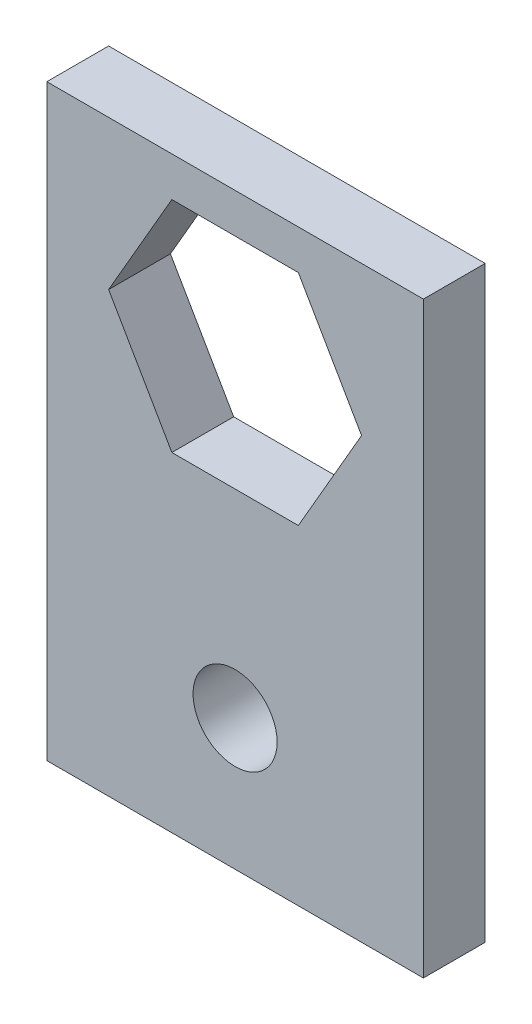
ISO-10303-21;
HEADER;
FILE_DESCRIPTION(('STEP AP214'),'2;1');
FILE_NAME('part.step','',(''),(''),'','','');
FILE_SCHEMA(('AUTOMOTIVE_DESIGN { 1 0 10303 214 1 1 1 1 }'));
ENDSEC;
DATA;
#1=APPLICATION_CONTEXT('core data for automotive mechanical design processes');
#2=APPLICATION_PROTOCOL_DEFINITION('international standard','automotive_design',2000,#1);
#3=PRODUCT_CONTEXT('',#1,'mechanical');
#4=PRODUCT('Part','Part','',(#3));
#5=PRODUCT_RELATED_PRODUCT_CATEGORY('part','',(#4));
#6=PRODUCT_DEFINITION_FORMATION('','',#4);
#7=PRODUCT_DEFINITION_CONTEXT('part definition',#1,'design');
#8=PRODUCT_DEFINITION('design','',#6,#7);
#9=PRODUCT_DEFINITION_SHAPE('','',#8);
#10=(LENGTH_UNIT() NAMED_UNIT(*) SI_UNIT(.MILLI.,.METRE.));
#11=(NAMED_UNIT(*) PLANE_ANGLE_UNIT() SI_UNIT($,.RADIAN.));
#12=(NAMED_UNIT(*) SI_UNIT($,.STERADIAN.) SOLID_ANGLE_UNIT());
#13=UNCERTAINTY_MEASURE_WITH_UNIT(LENGTH_MEASURE(1.E-05),#10,'distance_accuracy_value','');
#14=(GEOMETRIC_REPRESENTATION_CONTEXT(3) GLOBAL_UNCERTAINTY_ASSIGNED_CONTEXT((#13)) GLOBAL_UNIT_ASSIGNED_CONTEXT((#10,
#11,#12)) REPRESENTATION_CONTEXT('',''));
#15=CARTESIAN_POINT('',(0.,0.,0.));
#16=DIRECTION('',(0.,0.,1.));
#17=DIRECTION('',(1.,0.,0.));
#18=AXIS2_PLACEMENT_3D('',#15,#16,#17);
#19=CARTESIAN_POINT('',(-6.02952236372643,-182.568019635189,3.175));
#20=DIRECTION('',(0.,0.,1.));
#21=DIRECTION('',(1.,0.,0.));
#22=AXIS2_PLACEMENT_3D('',#19,#20,#21);
#23=PLANE('',#22);
#24=CARTESIAN_POINT('',(-6.02952236372656,-190.938169146798,3.175));
#25=DIRECTION('',(0.,0.,1.));
#26=DIRECTION('',(1.,0.,0.));
#27=AXIS2_PLACEMENT_3D('',#24,#25,#26);
#28=CIRCLE('',#27,2.159);
#29=CARTESIAN_POINT('',(-3.87052236372656,-190.938169146798,3.175));
#30=VERTEX_POINT('',#29);
#31=EDGE_CURVE('E19',#30,#30,#28,.F.);
#32=ORIENTED_EDGE('',*,*,#31,.T.);
#33=EDGE_LOOP('',(#32));
#34=FACE_BOUND('',#33,.T.);
#35=DIRECTION('',(0.5,-0.866025403784438,0.));
#36=VECTOR('',#35,1.);
#37=CARTESIAN_POINT('',(-9.27775271321431,-180.751070123579,3.175));
#38=LINE('',#37,#36);
#39=CARTESIAN_POINT('',(-9.27775271321431,-180.751070123579,3.175));
#40=VERTEX_POINT('',#39);
#41=CARTESIAN_POINT('',(-12.5259830627021,-175.124970123579,3.175));
#42=VERTEX_POINT('',#41);
#43=EDGE_CURVE('E139',#40,#42,#38,.F.);
#44=ORIENTED_EDGE('',*,*,#43,.T.);
#45=DIRECTION('',(-0.500000000000002,-0.866025403784438,0.));
#46=VECTOR('',#45,1.);
#47=CARTESIAN_POINT('',(-12.5259830627021,-175.124970123579,3.175));
#48=LINE('',#47,#46);
#49=CARTESIAN_POINT('',(-9.27775271321431,-169.498870123579,3.175));
#50=VERTEX_POINT('',#49);
#51=EDGE_CURVE('E144',#42,#50,#48,.F.);
#52=ORIENTED_EDGE('',*,*,#51,.T.);
#53=DIRECTION('',(1.,0.,0.));
#54=VECTOR('',#53,1.);
#55=CARTESIAN_POINT('',(-9.27775271321431,-169.498870123579,3.175));
#56=LINE('',#55,#54);
#57=CARTESIAN_POINT('',(-2.78129201423881,-169.498870123579,3.175));
#58=VERTEX_POINT('',#57);
#59=EDGE_CURVE('E150',#50,#58,#56,.T.);
#60=ORIENTED_EDGE('',*,*,#59,.T.);
#61=DIRECTION('',(-0.500000000000007,0.866025403784435,0.));
#62=VECTOR('',#61,1.);
#63=CARTESIAN_POINT('',(-2.78129201423881,-169.498870123579,3.175));
#64=LINE('',#63,#62);
#65=CARTESIAN_POINT('',(0.466938335248971,-175.124970123579,3.175));
#66=VERTEX_POINT('',#65);
#67=EDGE_CURVE('E124',#58,#66,#64,.F.);
#68=ORIENTED_EDGE('',*,*,#67,.T.);
#69=DIRECTION('',(0.5,0.866025403784439,0.));
#70=VECTOR('',#69,1.);
#71=CARTESIAN_POINT('',(0.46693833524897,-175.124970123579,3.175));
#72=LINE('',#71,#70);
#73=CARTESIAN_POINT('',(-2.78129201423879,-180.751070123579,3.175));
#74=VERTEX_POINT('',#73);
#75=EDGE_CURVE('E129',#66,#74,#72,.F.);
#76=ORIENTED_EDGE('',*,*,#75,.T.);
#77=DIRECTION('',(1.,0.,0.));
#78=VECTOR('',#77,1.);
#79=CARTESIAN_POINT('',(-2.78129201423881,-180.751070123579,3.175));
#80=LINE('',#79,#78);
#81=EDGE_CURVE('E134',#74,#40,#80,.F.);
#82=ORIENTED_EDGE('',*,*,#81,.T.);
#83=EDGE_LOOP('',(#44,#52,#60,#68,#76,#82));
#84=FACE_BOUND('',#83,.T.);
#85=DIRECTION('',(0.,1.,0.));
#86=VECTOR('',#85,1.);
#87=CARTESIAN_POINT('',(-15.7009830627021,-175.12497012358,3.175));
#88=LINE('',#87,#86);
#89=CARTESIAN_POINT('',(-15.700983062702,-197.669169146798,3.175));
#90=VERTEX_POINT('',#89);
#91=CARTESIAN_POINT('',(-15.7009830627022,-167.46687012358,3.175));
#92=VERTEX_POINT('',#91);
#93=EDGE_CURVE('E95',#90,#92,#88,.T.);
#94=ORIENTED_EDGE('',*,*,#93,.F.);
#95=DIRECTION('',(1.,0.,0.));
#96=VECTOR('',#95,1.);
#97=CARTESIAN_POINT('',(-2.85452236372618,-197.669169146798,3.175));
#98=LINE('',#97,#96);
#99=CARTESIAN_POINT('',(3.64193833524926,-197.669169146798,3.175));
#100=VERTEX_POINT('',#99);
#101=EDGE_CURVE('E90',#100,#90,#98,.F.);
#102=ORIENTED_EDGE('',*,*,#101,.F.);
#103=DIRECTION('',(0.,1.,0.));
#104=VECTOR('',#103,1.);
#105=CARTESIAN_POINT('',(3.64193833524897,-175.124970123579,3.175));
#106=LINE('',#105,#104);
#107=CARTESIAN_POINT('',(3.64193833524913,-167.46687012358,3.175));
#108=VERTEX_POINT('',#107);
#109=EDGE_CURVE('E107',#108,#100,#106,.F.);
#110=ORIENTED_EDGE('',*,*,#109,.F.);
#111=DIRECTION('',(1.,0.,0.));
#112=VECTOR('',#111,1.);
#113=CARTESIAN_POINT('',(-15.7009830627022,-167.46687012358,3.175));
#114=LINE('',#113,#112);
#115=EDGE_CURVE('E104',#92,#108,#114,.T.);
#116=ORIENTED_EDGE('',*,*,#115,.F.);
#117=EDGE_LOOP('',(#94,#102,#110,#116));
#118=FACE_BOUND('',#117,.T.);
#119=ADVANCED_FACE('F16',(#34,#84,#118),#23,.T.);
#120=CARTESIAN_POINT('',(-15.7009830627022,-167.46687012358,0.));
#121=DIRECTION('',(0.,1.,0.));
#122=DIRECTION('',(0.,0.,1.));
#123=AXIS2_PLACEMENT_3D('',#120,#121,#122);
#124=PLANE('',#123);
#125=DIRECTION('',(1.,0.,0.));
#126=VECTOR('',#125,1.);
#127=CARTESIAN_POINT('',(-6.02952236372643,-167.46687012358,0.));
#128=LINE('',#127,#126);
#129=CARTESIAN_POINT('',(3.641938335249,-167.46687012358,0.));
#130=VERTEX_POINT('',#129);
#131=CARTESIAN_POINT('',(-15.7009830627022,-167.46687012358,0.));
#132=VERTEX_POINT('',#131);
#133=EDGE_CURVE('E114',#130,#132,#128,.F.);
#134=ORIENTED_EDGE('',*,*,#133,.T.);
#135=DIRECTION('',(0.,0.,1.));
#136=VECTOR('',#135,1.);
#137=CARTESIAN_POINT('',(-15.7009830627021,-167.46687012358,0.));
#138=LINE('',#137,#136);
#139=EDGE_CURVE('E100',#92,#132,#138,.F.);
#140=ORIENTED_EDGE('',*,*,#139,.F.);
#141=ORIENTED_EDGE('',*,*,#115,.T.);
#142=DIRECTION('',(0.,0.,-1.));
#143=VECTOR('',#142,1.);
#144=CARTESIAN_POINT('',(3.64193833524897,-167.46687012358,0.));
#145=LINE('',#144,#143);
#146=EDGE_CURVE('E122',#130,#108,#145,.F.);
#147=ORIENTED_EDGE('',*,*,#146,.F.);
#148=EDGE_LOOP('',(#134,#140,#141,#147));
#149=FACE_BOUND('',#148,.T.);
#150=ADVANCED_FACE('F113',(#149),#124,.T.);
#151=CARTESIAN_POINT('',(-15.7009830627021,-175.12497012358,0.));
#152=DIRECTION('',(-1.,0.,0.));
#153=DIRECTION('',(0.,0.,1.));
#154=AXIS2_PLACEMENT_3D('',#151,#152,#153);
#155=PLANE('',#154);
#156=DIRECTION('',(0.,1.,0.));
#157=VECTOR('',#156,1.);
#158=CARTESIAN_POINT('',(-15.7009830627022,-182.568019635189,0.));
#159=LINE('',#158,#157);
#160=CARTESIAN_POINT('',(-15.700983062702,-197.669169146798,0.));
#161=VERTEX_POINT('',#160);
#162=EDGE_CURVE('E154',#132,#161,#159,.F.);
#163=ORIENTED_EDGE('',*,*,#162,.T.);
#164=DIRECTION('',(0.,0.,-1.));
#165=VECTOR('',#164,1.);
#166=CARTESIAN_POINT('',(-15.7009830627017,-197.669169146798,0.));
#167=LINE('',#166,#165);
#168=EDGE_CURVE('E102',#90,#161,#167,.T.);
#169=ORIENTED_EDGE('',*,*,#168,.F.);
#170=ORIENTED_EDGE('',*,*,#93,.T.);
#171=ORIENTED_EDGE('',*,*,#139,.T.);
#172=EDGE_LOOP('',(#163,#169,#170,#171));
#173=FACE_BOUND('',#172,.T.);
#174=ADVANCED_FACE('F98',(#173),#155,.T.);
#175=CARTESIAN_POINT('',(-2.85452236372618,-197.669169146798,0.));
#176=DIRECTION('',(0.,-1.,0.));
#177=DIRECTION('',(0.,0.,-1.));
#178=AXIS2_PLACEMENT_3D('',#175,#176,#177);
#179=PLANE('',#178);
#180=DIRECTION('',(1.,0.,0.));
#181=VECTOR('',#180,1.);
#182=CARTESIAN_POINT('',(-6.02952236372643,-197.669169146798,0.));
#183=LINE('',#182,#181);
#184=CARTESIAN_POINT('',(3.64193833524926,-197.669169146798,0.));
#185=VERTEX_POINT('',#184);
#186=EDGE_CURVE('E156',#161,#185,#183,.T.);
#187=ORIENTED_EDGE('',*,*,#186,.T.);
#188=DIRECTION('',(0.,0.,-1.));
#189=VECTOR('',#188,1.);
#190=CARTESIAN_POINT('',(3.64193833524897,-197.669169146798,0.));
#191=LINE('',#190,#189);
#192=EDGE_CURVE('E120',#100,#185,#191,.T.);
#193=ORIENTED_EDGE('',*,*,#192,.F.);
#194=ORIENTED_EDGE('',*,*,#101,.T.);
#195=ORIENTED_EDGE('',*,*,#168,.T.);
#196=EDGE_LOOP('',(#187,#193,#194,#195));
#197=FACE_BOUND('',#196,.T.);
#198=ADVANCED_FACE('F234',(#197),#179,.T.);
#199=CARTESIAN_POINT('',(3.64193833524897,-175.124970123579,0.));
#200=DIRECTION('',(1.,0.,0.));
#201=DIRECTION('',(0.,0.,-1.));
#202=AXIS2_PLACEMENT_3D('',#199,#200,#201);
#203=PLANE('',#202);
#204=DIRECTION('',(0.,1.,0.));
#205=VECTOR('',#204,1.);
#206=CARTESIAN_POINT('',(3.64193833524935,-182.568019635189,0.));
#207=LINE('',#206,#205);
#208=EDGE_CURVE('E159',#185,#130,#207,.T.);
#209=ORIENTED_EDGE('',*,*,#208,.T.);
#210=ORIENTED_EDGE('',*,*,#146,.T.);
#211=ORIENTED_EDGE('',*,*,#109,.T.);
#212=ORIENTED_EDGE('',*,*,#192,.T.);
#213=EDGE_LOOP('',(#209,#210,#211,#212));
#214=FACE_BOUND('',#213,.T.);
#215=ADVANCED_FACE('F231',(#214),#203,.T.);
#216=CARTESIAN_POINT('',(-2.78129201423881,-169.498870123579,0.));
#217=DIRECTION('',(0.866025403784435,0.500000000000007,0.));
#218=DIRECTION('',(-0.500000000000007,0.866025403784435,0.));
#219=AXIS2_PLACEMENT_3D('',#216,#217,#218);
#220=PLANE('',#219);
#221=DIRECTION('',(0.,0.,1.));
#222=VECTOR('',#221,1.);
#223=CARTESIAN_POINT('',(-2.78129201423881,-169.498870123579,0.));
#224=LINE('',#223,#222);
#225=CARTESIAN_POINT('',(-2.78129201423881,-169.498870123579,0.));
#226=VERTEX_POINT('',#225);
#227=EDGE_CURVE('E146',#58,#226,#224,.F.);
#228=ORIENTED_EDGE('',*,*,#227,.T.);
#229=DIRECTION('',(0.500000000000007,-0.866025403784435,0.));
#230=VECTOR('',#229,1.);
#231=CARTESIAN_POINT('',(-2.78129201423881,-169.498870123579,0.));
#232=LINE('',#231,#230);
#233=CARTESIAN_POINT('',(0.466938335248971,-175.124970123579,0.));
#234=VERTEX_POINT('',#233);
#235=EDGE_CURVE('E162',#226,#234,#232,.T.);
#236=ORIENTED_EDGE('',*,*,#235,.T.);
#237=DIRECTION('',(0.,0.,1.));
#238=VECTOR('',#237,1.);
#239=CARTESIAN_POINT('',(0.46693833524897,-175.124970123579,0.));
#240=LINE('',#239,#238);
#241=EDGE_CURVE('E126',#234,#66,#240,.T.);
#242=ORIENTED_EDGE('',*,*,#241,.T.);
#243=ORIENTED_EDGE('',*,*,#67,.F.);
#244=EDGE_LOOP('',(#228,#236,#242,#243));
#245=FACE_BOUND('',#244,.T.);
#246=ADVANCED_FACE('F199',(#245),#220,.F.);
#247=CARTESIAN_POINT('',(0.46693833524897,-175.124970123579,0.));
#248=DIRECTION('',(0.866025403784439,-0.5,0.));
#249=DIRECTION('',(0.5,0.866025403784439,0.));
#250=AXIS2_PLACEMENT_3D('',#247,#248,#249);
#251=PLANE('',#250);
#252=ORIENTED_EDGE('',*,*,#241,.F.);
#253=DIRECTION('',(-0.500000000000003,-0.866025403784437,0.));
#254=VECTOR('',#253,1.);
#255=CARTESIAN_POINT('',(0.46693833524897,-175.124970123579,0.));
#256=LINE('',#255,#254);
#257=CARTESIAN_POINT('',(-2.78129201423879,-180.751070123579,0.));
#258=VERTEX_POINT('',#257);
#259=EDGE_CURVE('E165',#234,#258,#256,.T.);
#260=ORIENTED_EDGE('',*,*,#259,.T.);
#261=DIRECTION('',(0.,0.,-1.));
#262=VECTOR('',#261,1.);
#263=CARTESIAN_POINT('',(-2.78129201423881,-180.751070123579,0.));
#264=LINE('',#263,#262);
#265=EDGE_CURVE('E131',#258,#74,#264,.F.);
#266=ORIENTED_EDGE('',*,*,#265,.T.);
#267=ORIENTED_EDGE('',*,*,#75,.F.);
#268=EDGE_LOOP('',(#252,#260,#266,#267));
#269=FACE_BOUND('',#268,.T.);
#270=ADVANCED_FACE('F197',(#269),#251,.F.);
#271=CARTESIAN_POINT('',(-2.78129201423881,-180.751070123579,0.));
#272=DIRECTION('',(0.,-1.,0.));
#273=DIRECTION('',(0.,0.,-1.));
#274=AXIS2_PLACEMENT_3D('',#271,#272,#273);
#275=PLANE('',#274);
#276=ORIENTED_EDGE('',*,*,#265,.F.);
#277=DIRECTION('',(1.,0.,0.));
#278=VECTOR('',#277,1.);
#279=CARTESIAN_POINT('',(-6.02952236372643,-180.751070123579,0.));
#280=LINE('',#279,#278);
#281=CARTESIAN_POINT('',(-9.27775271321431,-180.751070123579,0.));
#282=VERTEX_POINT('',#281);
#283=EDGE_CURVE('E168',#258,#282,#280,.F.);
#284=ORIENTED_EDGE('',*,*,#283,.T.);
#285=DIRECTION('',(0.,0.,1.));
#286=VECTOR('',#285,1.);
#287=CARTESIAN_POINT('',(-9.27775271321431,-180.751070123579,0.));
#288=LINE('',#287,#286);
#289=EDGE_CURVE('E136',#282,#40,#288,.T.);
#290=ORIENTED_EDGE('',*,*,#289,.T.);
#291=ORIENTED_EDGE('',*,*,#81,.F.);
#292=EDGE_LOOP('',(#276,#284,#290,#291));
#293=FACE_BOUND('',#292,.T.);
#294=ADVANCED_FACE('F193',(#293),#275,.F.);
#295=CARTESIAN_POINT('',(-9.27775271321431,-180.751070123579,0.));
#296=DIRECTION('',(-0.866025403784438,-0.5,0.));
#297=DIRECTION('',(0.5,-0.866025403784438,0.));
#298=AXIS2_PLACEMENT_3D('',#295,#296,#297);
#299=PLANE('',#298);
#300=ORIENTED_EDGE('',*,*,#289,.F.);
#301=DIRECTION('',(-0.5,0.866025403784438,0.));
#302=VECTOR('',#301,1.);
#303=CARTESIAN_POINT('',(-9.27775271321431,-180.751070123579,0.));
#304=LINE('',#303,#302);
#305=CARTESIAN_POINT('',(-12.5259830627021,-175.124970123579,0.));
#306=VERTEX_POINT('',#305);
#307=EDGE_CURVE('E171',#282,#306,#304,.T.);
#308=ORIENTED_EDGE('',*,*,#307,.T.);
#309=DIRECTION('',(0.,0.,1.));
#310=VECTOR('',#309,1.);
#311=CARTESIAN_POINT('',(-12.5259830627021,-175.124970123579,0.));
#312=LINE('',#311,#310);
#313=EDGE_CURVE('E141',#306,#42,#312,.T.);
#314=ORIENTED_EDGE('',*,*,#313,.T.);
#315=ORIENTED_EDGE('',*,*,#43,.F.);
#316=EDGE_LOOP('',(#300,#308,#314,#315));
#317=FACE_BOUND('',#316,.T.);
#318=ADVANCED_FACE('F190',(#317),#299,.F.);
#319=CARTESIAN_POINT('',(-12.5259830627021,-175.124970123579,0.));
#320=DIRECTION('',(-0.866025403784438,0.500000000000002,0.));
#321=DIRECTION('',(-0.500000000000002,-0.866025403784438,0.));
#322=AXIS2_PLACEMENT_3D('',#319,#320,#321);
#323=PLANE('',#322);
#324=ORIENTED_EDGE('',*,*,#313,.F.);
#325=DIRECTION('',(0.500000000000002,0.866025403784437,0.));
#326=VECTOR('',#325,1.);
#327=CARTESIAN_POINT('',(-12.5259830627021,-175.124970123579,0.));
#328=LINE('',#327,#326);
#329=CARTESIAN_POINT('',(-9.27775271321431,-169.498870123579,0.));
#330=VERTEX_POINT('',#329);
#331=EDGE_CURVE('E174',#306,#330,#328,.T.);
#332=ORIENTED_EDGE('',*,*,#331,.T.);
#333=DIRECTION('',(0.,0.,1.));
#334=VECTOR('',#333,1.);
#335=CARTESIAN_POINT('',(-9.27775271321431,-169.498870123579,0.));
#336=LINE('',#335,#334);
#337=EDGE_CURVE('E33',#330,#50,#336,.T.);
#338=ORIENTED_EDGE('',*,*,#337,.T.);
#339=ORIENTED_EDGE('',*,*,#51,.F.);
#340=EDGE_LOOP('',(#324,#332,#338,#339));
#341=FACE_BOUND('',#340,.T.);
#342=ADVANCED_FACE('F186',(#341),#323,.F.);
#343=CARTESIAN_POINT('',(-9.27775271321431,-169.498870123579,0.));
#344=DIRECTION('',(0.,1.,0.));
#345=DIRECTION('',(0.,0.,1.));
#346=AXIS2_PLACEMENT_3D('',#343,#344,#345);
#347=PLANE('',#346);
#348=ORIENTED_EDGE('',*,*,#337,.F.);
#349=DIRECTION('',(1.,0.,0.));
#350=VECTOR('',#349,1.);
#351=CARTESIAN_POINT('',(-6.02952236372643,-169.498870123579,0.));
#352=LINE('',#351,#350);
#353=EDGE_CURVE('E25',#330,#226,#352,.T.);
#354=ORIENTED_EDGE('',*,*,#353,.T.);
#355=ORIENTED_EDGE('',*,*,#227,.F.);
#356=ORIENTED_EDGE('',*,*,#59,.F.);
#357=EDGE_LOOP('',(#348,#354,#355,#356));
#358=FACE_BOUND('',#357,.T.);
#359=ADVANCED_FACE('F178',(#358),#347,.F.);
#360=CARTESIAN_POINT('',(-6.02952236372656,-190.938169146798,0.));
#361=DIRECTION('',(0.,0.,1.));
#362=DIRECTION('',(1.,0.,0.));
#363=AXIS2_PLACEMENT_3D('',#360,#361,#362);
#364=CYLINDRICAL_SURFACE('',#363,2.159);
#365=CARTESIAN_POINT('',(-6.02952236372656,-190.938169146798,0.));
#366=DIRECTION('',(0.,0.,1.));
#367=DIRECTION('',(1.,0.,0.));
#368=AXIS2_PLACEMENT_3D('',#365,#366,#367);
#369=CIRCLE('',#368,2.159);
#370=CARTESIAN_POINT('',(-3.87052236372656,-190.938169146798,0.));
#371=VERTEX_POINT('',#370);
#372=EDGE_CURVE('E10',#371,#371,#369,.F.);
#373=ORIENTED_EDGE('',*,*,#372,.T.);
#374=EDGE_LOOP('',(#373));
#375=FACE_BOUND('',#374,.T.);
#376=ORIENTED_EDGE('',*,*,#31,.F.);
#377=EDGE_LOOP('',(#376));
#378=FACE_BOUND('',#377,.T.);
#379=ADVANCED_FACE('F209',(#375,#378),#364,.F.);
#380=CARTESIAN_POINT('',(-6.02952236372643,-182.568019635189,0.));
#381=DIRECTION('',(0.,0.,1.));
#382=DIRECTION('',(1.,0.,0.));
#383=AXIS2_PLACEMENT_3D('',#380,#381,#382);
#384=PLANE('',#383);
#385=ORIENTED_EDGE('',*,*,#372,.F.);
#386=EDGE_LOOP('',(#385));
#387=FACE_BOUND('',#386,.T.);
#388=ORIENTED_EDGE('',*,*,#331,.F.);
#389=ORIENTED_EDGE('',*,*,#307,.F.);
#390=ORIENTED_EDGE('',*,*,#283,.F.);
#391=ORIENTED_EDGE('',*,*,#259,.F.);
#392=ORIENTED_EDGE('',*,*,#235,.F.);
#393=ORIENTED_EDGE('',*,*,#353,.F.);
#394=EDGE_LOOP('',(#388,#389,#390,#391,#392,#393));
#395=FACE_BOUND('',#394,.T.);
#396=ORIENTED_EDGE('',*,*,#186,.F.);
#397=ORIENTED_EDGE('',*,*,#162,.F.);
#398=ORIENTED_EDGE('',*,*,#133,.F.);
#399=ORIENTED_EDGE('',*,*,#208,.F.);
#400=EDGE_LOOP('',(#396,#397,#398,#399));
#401=FACE_BOUND('',#400,.T.);
#402=ADVANCED_FACE('F181',(#387,#395,#401),#384,.F.);
#403=CLOSED_SHELL('',(#119,#150,#174,#198,#215,#246,#270,#294,#318,#342,#359,#379,#402));
#404=MANIFOLD_SOLID_BREP('B1',#403);
#405=ADVANCED_BREP_SHAPE_REPRESENTATION('',(#18,#404),#14);
#406=SHAPE_DEFINITION_REPRESENTATION(#9,#405);
ENDSEC;
END-ISO-10303-21;
